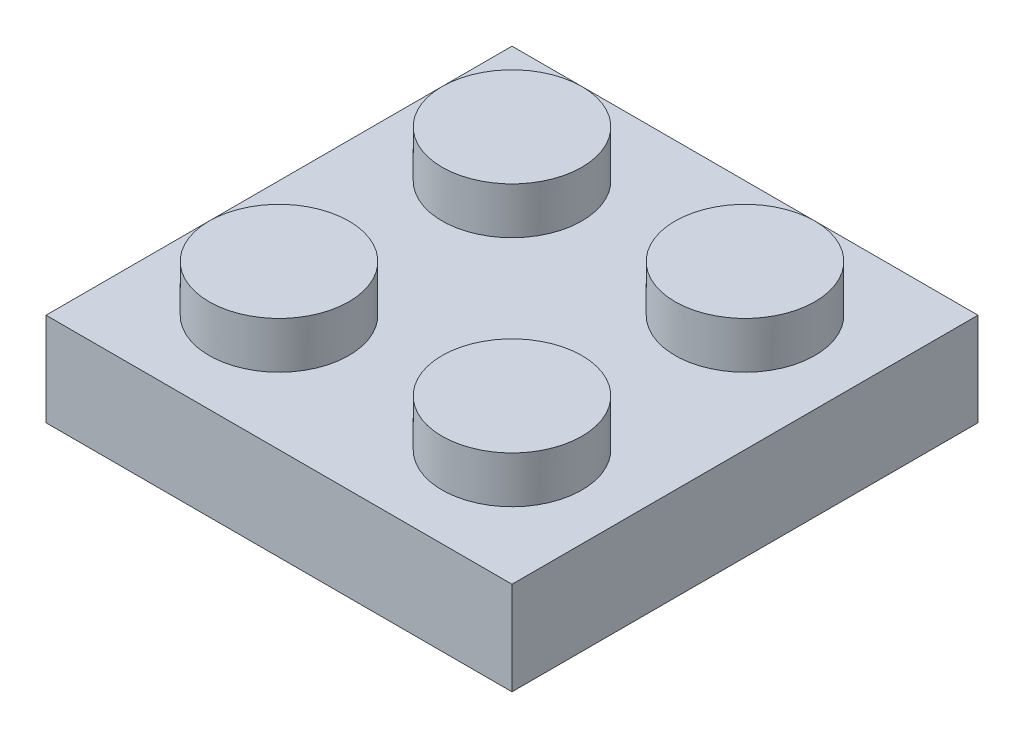
ISO-10303-21;
HEADER;
FILE_DESCRIPTION(('STEP AP214'),'2;1');
FILE_NAME('part.step','',(''),(''),'','','');
FILE_SCHEMA(('AUTOMOTIVE_DESIGN { 1 0 10303 214 1 1 1 1 }'));
ENDSEC;
DATA;
#1=APPLICATION_CONTEXT('core data for automotive mechanical design processes');
#2=APPLICATION_PROTOCOL_DEFINITION('international standard','automotive_design',2000,#1);
#3=PRODUCT_CONTEXT('',#1,'mechanical');
#4=PRODUCT('Part','Part','',(#3));
#5=PRODUCT_RELATED_PRODUCT_CATEGORY('part','',(#4));
#6=PRODUCT_DEFINITION_FORMATION('','',#4);
#7=PRODUCT_DEFINITION_CONTEXT('part definition',#1,'design');
#8=PRODUCT_DEFINITION('design','',#6,#7);
#9=PRODUCT_DEFINITION_SHAPE('','',#8);
#10=(LENGTH_UNIT() NAMED_UNIT(*) SI_UNIT(.MILLI.,.METRE.));
#11=(NAMED_UNIT(*) PLANE_ANGLE_UNIT() SI_UNIT($,.RADIAN.));
#12=(NAMED_UNIT(*) SI_UNIT($,.STERADIAN.) SOLID_ANGLE_UNIT());
#13=UNCERTAINTY_MEASURE_WITH_UNIT(LENGTH_MEASURE(1.E-05),#10,'distance_accuracy_value','');
#14=(GEOMETRIC_REPRESENTATION_CONTEXT(3) GLOBAL_UNCERTAINTY_ASSIGNED_CONTEXT((#13)) GLOBAL_UNIT_ASSIGNED_CONTEXT((#10,
#11,#12)) REPRESENTATION_CONTEXT('',''));
#15=CARTESIAN_POINT('',(0.,0.,0.));
#16=DIRECTION('',(0.,0.,1.));
#17=DIRECTION('',(1.,0.,0.));
#18=AXIS2_PLACEMENT_3D('',#15,#16,#17);
#19=CARTESIAN_POINT('',(0.,0.,0.));
#20=DIRECTION('',(0.,-1.,0.));
#21=DIRECTION('',(0.,0.,-1.));
#22=AXIS2_PLACEMENT_3D('',#19,#20,#21);
#23=PLANE('',#22);
#24=DIRECTION('',(0.,0.,1.));
#25=VECTOR('',#24,1.);
#26=CARTESIAN_POINT('',(0.,0.,0.));
#27=LINE('',#26,#25);
#28=CARTESIAN_POINT('',(0.,0.,-16.));
#29=VERTEX_POINT('',#28);
#30=CARTESIAN_POINT('',(0.,0.,0.));
#31=VERTEX_POINT('',#30);
#32=EDGE_CURVE('E192',#29,#31,#27,.T.);
#33=ORIENTED_EDGE('',*,*,#32,.F.);
#34=DIRECTION('',(-1.,0.,0.));
#35=VECTOR('',#34,1.);
#36=CARTESIAN_POINT('',(0.,0.,-16.));
#37=LINE('',#36,#35);
#38=CARTESIAN_POINT('',(16.,0.,-16.));
#39=VERTEX_POINT('',#38);
#40=EDGE_CURVE('E85',#39,#29,#37,.T.);
#41=ORIENTED_EDGE('',*,*,#40,.F.);
#42=DIRECTION('',(0.,0.,-1.));
#43=VECTOR('',#42,1.);
#44=CARTESIAN_POINT('',(16.,0.,0.));
#45=LINE('',#44,#43);
#46=CARTESIAN_POINT('',(16.,0.,0.));
#47=VERTEX_POINT('',#46);
#48=EDGE_CURVE('E210',#47,#39,#45,.T.);
#49=ORIENTED_EDGE('',*,*,#48,.F.);
#50=DIRECTION('',(1.,0.,0.));
#51=VECTOR('',#50,1.);
#52=CARTESIAN_POINT('',(0.,0.,0.));
#53=LINE('',#52,#51);
#54=EDGE_CURVE('E207',#31,#47,#53,.T.);
#55=ORIENTED_EDGE('',*,*,#54,.F.);
#56=EDGE_LOOP('',(#33,#41,#49,#55));
#57=FACE_BOUND('',#56,.T.);
#58=DIRECTION('',(-1.,0.,0.));
#59=VECTOR('',#58,1.);
#60=CARTESIAN_POINT('',(0.,0.,-14.4));
#61=LINE('',#60,#59);
#62=CARTESIAN_POINT('',(14.4,0.,-14.4));
#63=VERTEX_POINT('',#62);
#64=CARTESIAN_POINT('',(1.6,0.,-14.4));
#65=VERTEX_POINT('',#64);
#66=EDGE_CURVE('E175',#63,#65,#61,.T.);
#67=ORIENTED_EDGE('',*,*,#66,.T.);
#68=DIRECTION('',(0.,0.,1.));
#69=VECTOR('',#68,1.);
#70=CARTESIAN_POINT('',(1.6,0.,0.));
#71=LINE('',#70,#69);
#72=CARTESIAN_POINT('',(1.6,0.,-1.6));
#73=VERTEX_POINT('',#72);
#74=EDGE_CURVE('E166',#65,#73,#71,.T.);
#75=ORIENTED_EDGE('',*,*,#74,.T.);
#76=DIRECTION('',(1.,0.,0.));
#77=VECTOR('',#76,1.);
#78=CARTESIAN_POINT('',(0.,0.,-1.6));
#79=LINE('',#78,#77);
#80=CARTESIAN_POINT('',(14.4,0.,-1.6));
#81=VERTEX_POINT('',#80);
#82=EDGE_CURVE('E174',#73,#81,#79,.T.);
#83=ORIENTED_EDGE('',*,*,#82,.T.);
#84=DIRECTION('',(0.,0.,-1.));
#85=VECTOR('',#84,1.);
#86=CARTESIAN_POINT('',(14.4,0.,0.));
#87=LINE('',#86,#85);
#88=EDGE_CURVE('E55',#81,#63,#87,.T.);
#89=ORIENTED_EDGE('',*,*,#88,.T.);
#90=EDGE_LOOP('',(#67,#75,#83,#89));
#91=FACE_BOUND('',#90,.T.);
#92=ADVANCED_FACE('F39',(#57,#91),#23,.T.);
#93=CARTESIAN_POINT('',(4.,4.8,-12.));
#94=DIRECTION('',(0.,1.,0.));
#95=DIRECTION('',(0.,0.,1.));
#96=AXIS2_PLACEMENT_3D('',#93,#94,#95);
#97=PLANE('',#96);
#98=CARTESIAN_POINT('',(4.,4.8,-12.));
#99=DIRECTION('',(0.,1.,0.));
#100=DIRECTION('',(0.,0.,1.));
#101=AXIS2_PLACEMENT_3D('',#98,#99,#100);
#102=CIRCLE('',#101,2.4);
#103=CARTESIAN_POINT('',(4.,4.8,-9.6));
#104=VERTEX_POINT('',#103);
#105=EDGE_CURVE('E11',#104,#104,#102,.T.);
#106=ORIENTED_EDGE('',*,*,#105,.T.);
#107=EDGE_LOOP('',(#106));
#108=FACE_BOUND('',#107,.T.);
#109=ADVANCED_FACE('F41',(#108),#97,.T.);
#110=CARTESIAN_POINT('',(4.,4.8,-12.));
#111=DIRECTION('',(0.,-1.,0.));
#112=DIRECTION('',(0.,0.,-1.));
#113=AXIS2_PLACEMENT_3D('',#110,#111,#112);
#114=CYLINDRICAL_SURFACE('',#113,2.4);
#115=ORIENTED_EDGE('',*,*,#105,.F.);
#116=EDGE_LOOP('',(#115));
#117=FACE_BOUND('',#116,.T.);
#118=CARTESIAN_POINT('',(4.,3.2,-12.));
#119=DIRECTION('',(0.,-1.,0.));
#120=DIRECTION('',(0.,0.,-1.));
#121=AXIS2_PLACEMENT_3D('',#118,#119,#120);
#122=CIRCLE('',#121,2.4);
#123=CARTESIAN_POINT('',(4.,3.2,-14.4));
#124=VERTEX_POINT('',#123);
#125=EDGE_CURVE('E48',#124,#124,#122,.F.);
#126=ORIENTED_EDGE('',*,*,#125,.T.);
#127=EDGE_LOOP('',(#126));
#128=FACE_BOUND('',#127,.T.);
#129=ADVANCED_FACE('F246',(#117,#128),#114,.T.);
#130=CARTESIAN_POINT('',(12.,4.8,-12.));
#131=DIRECTION('',(0.,1.,0.));
#132=DIRECTION('',(0.,0.,1.));
#133=AXIS2_PLACEMENT_3D('',#130,#131,#132);
#134=PLANE('',#133);
#135=CARTESIAN_POINT('',(12.,4.8,-12.));
#136=DIRECTION('',(0.,1.,0.));
#137=DIRECTION('',(0.,0.,1.));
#138=AXIS2_PLACEMENT_3D('',#135,#136,#137);
#139=CIRCLE('',#138,2.4);
#140=CARTESIAN_POINT('',(12.,4.8,-9.6));
#141=VERTEX_POINT('',#140);
#142=EDGE_CURVE('E239',#141,#141,#139,.T.);
#143=ORIENTED_EDGE('',*,*,#142,.T.);
#144=EDGE_LOOP('',(#143));
#145=FACE_BOUND('',#144,.T.);
#146=ADVANCED_FACE('F288',(#145),#134,.T.);
#147=CARTESIAN_POINT('',(12.,4.8,-12.));
#148=DIRECTION('',(0.,-1.,0.));
#149=DIRECTION('',(0.,0.,-1.));
#150=AXIS2_PLACEMENT_3D('',#147,#148,#149);
#151=CYLINDRICAL_SURFACE('',#150,2.4);
#152=ORIENTED_EDGE('',*,*,#142,.F.);
#153=EDGE_LOOP('',(#152));
#154=FACE_BOUND('',#153,.T.);
#155=CARTESIAN_POINT('',(12.,3.2,-12.));
#156=DIRECTION('',(0.,-1.,0.));
#157=DIRECTION('',(0.,0.,-1.));
#158=AXIS2_PLACEMENT_3D('',#155,#156,#157);
#159=CIRCLE('',#158,2.4);
#160=CARTESIAN_POINT('',(12.,3.2,-14.4));
#161=VERTEX_POINT('',#160);
#162=EDGE_CURVE('E235',#161,#161,#159,.F.);
#163=ORIENTED_EDGE('',*,*,#162,.T.);
#164=EDGE_LOOP('',(#163));
#165=FACE_BOUND('',#164,.T.);
#166=ADVANCED_FACE('F284',(#154,#165),#151,.T.);
#167=CARTESIAN_POINT('',(0.,3.2,0.));
#168=DIRECTION('',(1.,0.,0.));
#169=DIRECTION('',(0.,0.,-1.));
#170=AXIS2_PLACEMENT_3D('',#167,#168,#169);
#171=PLANE('',#170);
#172=ORIENTED_EDGE('',*,*,#32,.T.);
#173=DIRECTION('',(0.,-1.,0.));
#174=VECTOR('',#173,1.);
#175=CARTESIAN_POINT('',(0.,3.2,0.));
#176=LINE('',#175,#174);
#177=CARTESIAN_POINT('',(0.,3.2,0.));
#178=VERTEX_POINT('',#177);
#179=EDGE_CURVE('E224',#178,#31,#176,.T.);
#180=ORIENTED_EDGE('',*,*,#179,.F.);
#181=DIRECTION('',(0.,0.,1.));
#182=VECTOR('',#181,1.);
#183=CARTESIAN_POINT('',(0.,3.2,0.));
#184=LINE('',#183,#182);
#185=CARTESIAN_POINT('',(0.,3.2,-16.));
#186=VERTEX_POINT('',#185);
#187=EDGE_CURVE('E193',#186,#178,#184,.T.);
#188=ORIENTED_EDGE('',*,*,#187,.F.);
#189=DIRECTION('',(0.,-1.,0.));
#190=VECTOR('',#189,1.);
#191=CARTESIAN_POINT('',(0.,3.2,-16.));
#192=LINE('',#191,#190);
#193=EDGE_CURVE('E203',#186,#29,#192,.T.);
#194=ORIENTED_EDGE('',*,*,#193,.T.);
#195=EDGE_LOOP('',(#172,#180,#188,#194));
#196=FACE_BOUND('',#195,.T.);
#197=ADVANCED_FACE('F281',(#196),#171,.F.);
#198=CARTESIAN_POINT('',(0.,3.2,0.));
#199=DIRECTION('',(0.,0.,-1.));
#200=DIRECTION('',(-1.,0.,0.));
#201=AXIS2_PLACEMENT_3D('',#198,#199,#200);
#202=PLANE('',#201);
#203=ORIENTED_EDGE('',*,*,#54,.T.);
#204=DIRECTION('',(0.,-1.,0.));
#205=VECTOR('',#204,1.);
#206=CARTESIAN_POINT('',(16.,3.2,0.));
#207=LINE('',#206,#205);
#208=CARTESIAN_POINT('',(16.,3.2,0.));
#209=VERTEX_POINT('',#208);
#210=EDGE_CURVE('E220',#209,#47,#207,.T.);
#211=ORIENTED_EDGE('',*,*,#210,.F.);
#212=DIRECTION('',(1.,0.,0.));
#213=VECTOR('',#212,1.);
#214=CARTESIAN_POINT('',(0.,3.2,0.));
#215=LINE('',#214,#213);
#216=EDGE_CURVE('E93',#178,#209,#215,.T.);
#217=ORIENTED_EDGE('',*,*,#216,.F.);
#218=ORIENTED_EDGE('',*,*,#179,.T.);
#219=EDGE_LOOP('',(#203,#211,#217,#218));
#220=FACE_BOUND('',#219,.T.);
#221=ADVANCED_FACE('F277',(#220),#202,.F.);
#222=CARTESIAN_POINT('',(16.,3.2,0.));
#223=DIRECTION('',(-1.,0.,0.));
#224=DIRECTION('',(0.,0.,1.));
#225=AXIS2_PLACEMENT_3D('',#222,#223,#224);
#226=PLANE('',#225);
#227=ORIENTED_EDGE('',*,*,#48,.T.);
#228=DIRECTION('',(0.,-1.,0.));
#229=VECTOR('',#228,1.);
#230=CARTESIAN_POINT('',(16.,3.2,-16.));
#231=LINE('',#230,#229);
#232=CARTESIAN_POINT('',(16.,3.2,-16.));
#233=VERTEX_POINT('',#232);
#234=EDGE_CURVE('E217',#233,#39,#231,.T.);
#235=ORIENTED_EDGE('',*,*,#234,.F.);
#236=DIRECTION('',(0.,0.,-1.));
#237=VECTOR('',#236,1.);
#238=CARTESIAN_POINT('',(16.,3.2,0.));
#239=LINE('',#238,#237);
#240=EDGE_CURVE('E198',#209,#233,#239,.T.);
#241=ORIENTED_EDGE('',*,*,#240,.F.);
#242=ORIENTED_EDGE('',*,*,#210,.T.);
#243=EDGE_LOOP('',(#227,#235,#241,#242));
#244=FACE_BOUND('',#243,.T.);
#245=ADVANCED_FACE('F261',(#244),#226,.F.);
#246=CARTESIAN_POINT('',(0.,3.2,-16.));
#247=DIRECTION('',(0.,0.,1.));
#248=DIRECTION('',(1.,0.,0.));
#249=AXIS2_PLACEMENT_3D('',#246,#247,#248);
#250=PLANE('',#249);
#251=ORIENTED_EDGE('',*,*,#40,.T.);
#252=ORIENTED_EDGE('',*,*,#193,.F.);
#253=DIRECTION('',(-1.,0.,0.));
#254=VECTOR('',#253,1.);
#255=CARTESIAN_POINT('',(0.,3.2,-16.));
#256=LINE('',#255,#254);
#257=EDGE_CURVE('E64',#233,#186,#256,.T.);
#258=ORIENTED_EDGE('',*,*,#257,.F.);
#259=ORIENTED_EDGE('',*,*,#234,.T.);
#260=EDGE_LOOP('',(#251,#252,#258,#259));
#261=FACE_BOUND('',#260,.T.);
#262=ADVANCED_FACE('F251',(#261),#250,.F.);
#263=CARTESIAN_POINT('',(0.,3.2,0.));
#264=DIRECTION('',(0.,-1.,0.));
#265=DIRECTION('',(0.,0.,-1.));
#266=AXIS2_PLACEMENT_3D('',#263,#264,#265);
#267=PLANE('',#266);
#268=CARTESIAN_POINT('',(4.,3.2,-4.));
#269=DIRECTION('',(0.,-1.,0.));
#270=DIRECTION('',(0.,0.,-1.));
#271=AXIS2_PLACEMENT_3D('',#268,#269,#270);
#272=CIRCLE('',#271,2.4);
#273=CARTESIAN_POINT('',(4.,3.2,-6.4));
#274=VERTEX_POINT('',#273);
#275=EDGE_CURVE('E231',#274,#274,#272,.F.);
#276=ORIENTED_EDGE('',*,*,#275,.F.);
#277=EDGE_LOOP('',(#276));
#278=FACE_BOUND('',#277,.T.);
#279=CARTESIAN_POINT('',(12.,3.2,-4.));
#280=DIRECTION('',(0.,-1.,0.));
#281=DIRECTION('',(0.,0.,-1.));
#282=AXIS2_PLACEMENT_3D('',#279,#280,#281);
#283=CIRCLE('',#282,2.4);
#284=CARTESIAN_POINT('',(12.,3.2,-6.4));
#285=VERTEX_POINT('',#284);
#286=EDGE_CURVE('E227',#285,#285,#283,.F.);
#287=ORIENTED_EDGE('',*,*,#286,.F.);
#288=EDGE_LOOP('',(#287));
#289=FACE_BOUND('',#288,.T.);
#290=ORIENTED_EDGE('',*,*,#187,.T.);
#291=ORIENTED_EDGE('',*,*,#216,.T.);
#292=ORIENTED_EDGE('',*,*,#240,.T.);
#293=ORIENTED_EDGE('',*,*,#257,.T.);
#294=EDGE_LOOP('',(#290,#291,#292,#293));
#295=FACE_BOUND('',#294,.T.);
#296=ORIENTED_EDGE('',*,*,#162,.F.);
#297=EDGE_LOOP('',(#296));
#298=FACE_BOUND('',#297,.T.);
#299=ORIENTED_EDGE('',*,*,#125,.F.);
#300=EDGE_LOOP('',(#299));
#301=FACE_BOUND('',#300,.T.);
#302=ADVANCED_FACE('F248',(#278,#289,#295,#298,#301),#267,.F.);
#303=CARTESIAN_POINT('',(12.,4.8,-4.));
#304=DIRECTION('',(0.,-1.,0.));
#305=DIRECTION('',(0.,0.,-1.));
#306=AXIS2_PLACEMENT_3D('',#303,#304,#305);
#307=CYLINDRICAL_SURFACE('',#306,2.4);
#308=CARTESIAN_POINT('',(12.,4.8,-4.));
#309=DIRECTION('',(0.,1.,0.));
#310=DIRECTION('',(0.,0.,1.));
#311=AXIS2_PLACEMENT_3D('',#308,#309,#310);
#312=CIRCLE('',#311,2.4);
#313=CARTESIAN_POINT('',(12.,4.8,-1.6));
#314=VERTEX_POINT('',#313);
#315=EDGE_CURVE('E187',#314,#314,#312,.T.);
#316=ORIENTED_EDGE('',*,*,#315,.F.);
#317=EDGE_LOOP('',(#316));
#318=FACE_BOUND('',#317,.T.);
#319=ORIENTED_EDGE('',*,*,#286,.T.);
#320=EDGE_LOOP('',(#319));
#321=FACE_BOUND('',#320,.T.);
#322=ADVANCED_FACE('F250',(#318,#321),#307,.T.);
#323=CARTESIAN_POINT('',(12.,4.8,-4.));
#324=DIRECTION('',(0.,1.,0.));
#325=DIRECTION('',(0.,0.,1.));
#326=AXIS2_PLACEMENT_3D('',#323,#324,#325);
#327=PLANE('',#326);
#328=ORIENTED_EDGE('',*,*,#315,.T.);
#329=EDGE_LOOP('',(#328));
#330=FACE_BOUND('',#329,.T.);
#331=ADVANCED_FACE('F258',(#330),#327,.T.);
#332=CARTESIAN_POINT('',(4.,4.8,-4.));
#333=DIRECTION('',(0.,-1.,0.));
#334=DIRECTION('',(0.,0.,-1.));
#335=AXIS2_PLACEMENT_3D('',#332,#333,#334);
#336=CYLINDRICAL_SURFACE('',#335,2.4);
#337=CARTESIAN_POINT('',(4.,4.8,-4.));
#338=DIRECTION('',(0.,1.,0.));
#339=DIRECTION('',(0.,0.,1.));
#340=AXIS2_PLACEMENT_3D('',#337,#338,#339);
#341=CIRCLE('',#340,2.4);
#342=CARTESIAN_POINT('',(4.,4.8,-1.6));
#343=VERTEX_POINT('',#342);
#344=EDGE_CURVE('E183',#343,#343,#341,.T.);
#345=ORIENTED_EDGE('',*,*,#344,.F.);
#346=EDGE_LOOP('',(#345));
#347=FACE_BOUND('',#346,.T.);
#348=ORIENTED_EDGE('',*,*,#275,.T.);
#349=EDGE_LOOP('',(#348));
#350=FACE_BOUND('',#349,.T.);
#351=ADVANCED_FACE('F338',(#347,#350),#336,.T.);
#352=CARTESIAN_POINT('',(4.,4.8,-4.));
#353=DIRECTION('',(0.,1.,0.));
#354=DIRECTION('',(0.,0.,1.));
#355=AXIS2_PLACEMENT_3D('',#352,#353,#354);
#356=PLANE('',#355);
#357=ORIENTED_EDGE('',*,*,#344,.T.);
#358=EDGE_LOOP('',(#357));
#359=FACE_BOUND('',#358,.T.);
#360=ADVANCED_FACE('F360',(#359),#356,.T.);
#361=CARTESIAN_POINT('',(4.,3.2,-12.));
#362=DIRECTION('',(0.,1.,0.));
#363=DIRECTION('',(0.,0.,1.));
#364=AXIS2_PLACEMENT_3D('',#361,#362,#363);
#365=PLANE('',#364);
#366=CARTESIAN_POINT('',(4.,3.2,-12.));
#367=DIRECTION('',(0.,1.,0.));
#368=DIRECTION('',(0.,0.,1.));
#369=AXIS2_PLACEMENT_3D('',#366,#367,#368);
#370=CIRCLE('',#369,0.799999999999999);
#371=CARTESIAN_POINT('',(4.,3.2,-11.2));
#372=VERTEX_POINT('',#371);
#373=EDGE_CURVE('E188',#372,#372,#370,.T.);
#374=ORIENTED_EDGE('',*,*,#373,.F.);
#375=EDGE_LOOP('',(#374));
#376=FACE_BOUND('',#375,.T.);
#377=ADVANCED_FACE('F369',(#376),#365,.F.);
#378=CARTESIAN_POINT('',(4.,4.8,-12.));
#379=DIRECTION('',(0.,-1.,0.));
#380=DIRECTION('',(0.,0.,-1.));
#381=AXIS2_PLACEMENT_3D('',#378,#379,#380);
#382=CYLINDRICAL_SURFACE('',#381,0.799999999999999);
#383=ORIENTED_EDGE('',*,*,#373,.T.);
#384=EDGE_LOOP('',(#383));
#385=FACE_BOUND('',#384,.T.);
#386=CARTESIAN_POINT('',(4.,1.6,-12.));
#387=DIRECTION('',(0.,-1.,0.));
#388=DIRECTION('',(0.,0.,-1.));
#389=AXIS2_PLACEMENT_3D('',#386,#387,#388);
#390=CIRCLE('',#389,0.799999999999999);
#391=CARTESIAN_POINT('',(4.,1.6,-12.8));
#392=VERTEX_POINT('',#391);
#393=EDGE_CURVE('E154',#392,#392,#390,.F.);
#394=ORIENTED_EDGE('',*,*,#393,.F.);
#395=EDGE_LOOP('',(#394));
#396=FACE_BOUND('',#395,.T.);
#397=ADVANCED_FACE('F382',(#385,#396),#382,.F.);
#398=CARTESIAN_POINT('',(12.,3.2,-12.));
#399=DIRECTION('',(0.,1.,0.));
#400=DIRECTION('',(0.,0.,1.));
#401=AXIS2_PLACEMENT_3D('',#398,#399,#400);
#402=PLANE('',#401);
#403=CARTESIAN_POINT('',(12.,3.2,-12.));
#404=DIRECTION('',(0.,1.,0.));
#405=DIRECTION('',(0.,0.,1.));
#406=AXIS2_PLACEMENT_3D('',#403,#404,#405);
#407=CIRCLE('',#406,0.799999999999999);
#408=CARTESIAN_POINT('',(12.,3.2,-11.2));
#409=VERTEX_POINT('',#408);
#410=EDGE_CURVE('E149',#409,#409,#407,.T.);
#411=ORIENTED_EDGE('',*,*,#410,.F.);
#412=EDGE_LOOP('',(#411));
#413=FACE_BOUND('',#412,.T.);
#414=ADVANCED_FACE('F391',(#413),#402,.F.);
#415=CARTESIAN_POINT('',(12.,4.8,-12.));
#416=DIRECTION('',(0.,-1.,0.));
#417=DIRECTION('',(0.,0.,-1.));
#418=AXIS2_PLACEMENT_3D('',#415,#416,#417);
#419=CYLINDRICAL_SURFACE('',#418,0.799999999999999);
#420=ORIENTED_EDGE('',*,*,#410,.T.);
#421=EDGE_LOOP('',(#420));
#422=FACE_BOUND('',#421,.T.);
#423=CARTESIAN_POINT('',(12.,1.6,-12.));
#424=DIRECTION('',(0.,-1.,0.));
#425=DIRECTION('',(0.,0.,-1.));
#426=AXIS2_PLACEMENT_3D('',#423,#424,#425);
#427=CIRCLE('',#426,0.799999999999999);
#428=CARTESIAN_POINT('',(12.,1.6,-12.8));
#429=VERTEX_POINT('',#428);
#430=EDGE_CURVE('E145',#429,#429,#427,.F.);
#431=ORIENTED_EDGE('',*,*,#430,.F.);
#432=EDGE_LOOP('',(#431));
#433=FACE_BOUND('',#432,.T.);
#434=ADVANCED_FACE('F400',(#422,#433),#419,.F.);
#435=CARTESIAN_POINT('',(1.6,3.2,0.));
#436=DIRECTION('',(1.,0.,0.));
#437=DIRECTION('',(0.,0.,-1.));
#438=AXIS2_PLACEMENT_3D('',#435,#436,#437);
#439=PLANE('',#438);
#440=ORIENTED_EDGE('',*,*,#74,.F.);
#441=DIRECTION('',(0.,-1.,0.));
#442=VECTOR('',#441,1.);
#443=CARTESIAN_POINT('',(1.6,3.2,-14.4));
#444=LINE('',#443,#442);
#445=CARTESIAN_POINT('',(1.6,1.6,-14.4));
#446=VERTEX_POINT('',#445);
#447=EDGE_CURVE('E141',#446,#65,#444,.T.);
#448=ORIENTED_EDGE('',*,*,#447,.F.);
#449=DIRECTION('',(0.,0.,1.));
#450=VECTOR('',#449,1.);
#451=CARTESIAN_POINT('',(1.6,1.6,0.));
#452=LINE('',#451,#450);
#453=CARTESIAN_POINT('',(1.6,1.6,-1.6));
#454=VERTEX_POINT('',#453);
#455=EDGE_CURVE('E127',#446,#454,#452,.T.);
#456=ORIENTED_EDGE('',*,*,#455,.T.);
#457=DIRECTION('',(0.,-1.,0.));
#458=VECTOR('',#457,1.);
#459=CARTESIAN_POINT('',(1.6,3.2,-1.6));
#460=LINE('',#459,#458);
#461=EDGE_CURVE('E120',#454,#73,#460,.T.);
#462=ORIENTED_EDGE('',*,*,#461,.T.);
#463=EDGE_LOOP('',(#440,#448,#456,#462));
#464=FACE_BOUND('',#463,.T.);
#465=ADVANCED_FACE('F409',(#464),#439,.T.);
#466=CARTESIAN_POINT('',(0.,3.2,-1.6));
#467=DIRECTION('',(0.,0.,-1.));
#468=DIRECTION('',(-1.,0.,0.));
#469=AXIS2_PLACEMENT_3D('',#466,#467,#468);
#470=PLANE('',#469);
#471=ORIENTED_EDGE('',*,*,#82,.F.);
#472=ORIENTED_EDGE('',*,*,#461,.F.);
#473=DIRECTION('',(1.,0.,0.));
#474=VECTOR('',#473,1.);
#475=CARTESIAN_POINT('',(0.,1.6,-1.6));
#476=LINE('',#475,#474);
#477=CARTESIAN_POINT('',(14.4,1.6,-1.6));
#478=VERTEX_POINT('',#477);
#479=EDGE_CURVE('E115',#454,#478,#476,.T.);
#480=ORIENTED_EDGE('',*,*,#479,.T.);
#481=DIRECTION('',(0.,-1.,0.));
#482=VECTOR('',#481,1.);
#483=CARTESIAN_POINT('',(14.4,3.2,-1.6));
#484=LINE('',#483,#482);
#485=EDGE_CURVE('E117',#478,#81,#484,.T.);
#486=ORIENTED_EDGE('',*,*,#485,.T.);
#487=EDGE_LOOP('',(#471,#472,#480,#486));
#488=FACE_BOUND('',#487,.T.);
#489=ADVANCED_FACE('F116',(#488),#470,.T.);
#490=CARTESIAN_POINT('',(14.4,3.2,0.));
#491=DIRECTION('',(-1.,0.,0.));
#492=DIRECTION('',(0.,0.,1.));
#493=AXIS2_PLACEMENT_3D('',#490,#491,#492);
#494=PLANE('',#493);
#495=ORIENTED_EDGE('',*,*,#88,.F.);
#496=ORIENTED_EDGE('',*,*,#485,.F.);
#497=DIRECTION('',(0.,0.,-1.));
#498=VECTOR('',#497,1.);
#499=CARTESIAN_POINT('',(14.4,1.6,0.));
#500=LINE('',#499,#498);
#501=CARTESIAN_POINT('',(14.4,1.6,-14.4));
#502=VERTEX_POINT('',#501);
#503=EDGE_CURVE('E126',#478,#502,#500,.T.);
#504=ORIENTED_EDGE('',*,*,#503,.T.);
#505=DIRECTION('',(0.,-1.,0.));
#506=VECTOR('',#505,1.);
#507=CARTESIAN_POINT('',(14.4,3.2,-14.4));
#508=LINE('',#507,#506);
#509=EDGE_CURVE('E132',#502,#63,#508,.T.);
#510=ORIENTED_EDGE('',*,*,#509,.T.);
#511=EDGE_LOOP('',(#495,#496,#504,#510));
#512=FACE_BOUND('',#511,.T.);
#513=ADVANCED_FACE('F129',(#512),#494,.T.);
#514=CARTESIAN_POINT('',(0.,3.2,-14.4));
#515=DIRECTION('',(0.,0.,1.));
#516=DIRECTION('',(1.,0.,0.));
#517=AXIS2_PLACEMENT_3D('',#514,#515,#516);
#518=PLANE('',#517);
#519=ORIENTED_EDGE('',*,*,#66,.F.);
#520=ORIENTED_EDGE('',*,*,#509,.F.);
#521=DIRECTION('',(-1.,0.,0.));
#522=VECTOR('',#521,1.);
#523=CARTESIAN_POINT('',(0.,1.6,-14.4));
#524=LINE('',#523,#522);
#525=EDGE_CURVE('E137',#502,#446,#524,.T.);
#526=ORIENTED_EDGE('',*,*,#525,.T.);
#527=ORIENTED_EDGE('',*,*,#447,.T.);
#528=EDGE_LOOP('',(#519,#520,#526,#527));
#529=FACE_BOUND('',#528,.T.);
#530=ADVANCED_FACE('F433',(#529),#518,.T.);
#531=CARTESIAN_POINT('',(0.,1.6,0.));
#532=DIRECTION('',(0.,-1.,0.));
#533=DIRECTION('',(0.,0.,-1.));
#534=AXIS2_PLACEMENT_3D('',#531,#532,#533);
#535=PLANE('',#534);
#536=CARTESIAN_POINT('',(4.,1.6,-4.));
#537=DIRECTION('',(0.,-1.,0.));
#538=DIRECTION('',(0.,0.,-1.));
#539=AXIS2_PLACEMENT_3D('',#536,#537,#538);
#540=CIRCLE('',#539,0.799999999999999);
#541=CARTESIAN_POINT('',(4.,1.6,-4.8));
#542=VERTEX_POINT('',#541);
#543=EDGE_CURVE('E150',#542,#542,#540,.F.);
#544=ORIENTED_EDGE('',*,*,#543,.T.);
#545=EDGE_LOOP('',(#544));
#546=FACE_BOUND('',#545,.T.);
#547=CARTESIAN_POINT('',(12.,1.6,-4.));
#548=DIRECTION('',(0.,-1.,0.));
#549=DIRECTION('',(0.,0.,-1.));
#550=AXIS2_PLACEMENT_3D('',#547,#548,#549);
#551=CIRCLE('',#550,0.799999999999999);
#552=CARTESIAN_POINT('',(12.,1.6,-4.8));
#553=VERTEX_POINT('',#552);
#554=EDGE_CURVE('E157',#553,#553,#551,.F.);
#555=ORIENTED_EDGE('',*,*,#554,.T.);
#556=EDGE_LOOP('',(#555));
#557=FACE_BOUND('',#556,.T.);
#558=ORIENTED_EDGE('',*,*,#455,.F.);
#559=ORIENTED_EDGE('',*,*,#525,.F.);
#560=ORIENTED_EDGE('',*,*,#503,.F.);
#561=ORIENTED_EDGE('',*,*,#479,.F.);
#562=EDGE_LOOP('',(#558,#559,#560,#561));
#563=FACE_BOUND('',#562,.T.);
#564=ORIENTED_EDGE('',*,*,#430,.T.);
#565=EDGE_LOOP('',(#564));
#566=FACE_BOUND('',#565,.T.);
#567=ORIENTED_EDGE('',*,*,#393,.T.);
#568=EDGE_LOOP('',(#567));
#569=FACE_BOUND('',#568,.T.);
#570=ADVANCED_FACE('F135',(#546,#557,#563,#566,#569),#535,.T.);
#571=CARTESIAN_POINT('',(12.,4.8,-4.));
#572=DIRECTION('',(0.,-1.,0.));
#573=DIRECTION('',(0.,0.,-1.));
#574=AXIS2_PLACEMENT_3D('',#571,#572,#573);
#575=CYLINDRICAL_SURFACE('',#574,0.799999999999999);
#576=CARTESIAN_POINT('',(12.,3.2,-4.));
#577=DIRECTION('',(0.,1.,0.));
#578=DIRECTION('',(0.,0.,1.));
#579=AXIS2_PLACEMENT_3D('',#576,#577,#578);
#580=CIRCLE('',#579,0.799999999999999);
#581=CARTESIAN_POINT('',(12.,3.2,-3.2));
#582=VERTEX_POINT('',#581);
#583=EDGE_CURVE('E162',#582,#582,#580,.T.);
#584=ORIENTED_EDGE('',*,*,#583,.T.);
#585=EDGE_LOOP('',(#584));
#586=FACE_BOUND('',#585,.T.);
#587=ORIENTED_EDGE('',*,*,#554,.F.);
#588=EDGE_LOOP('',(#587));
#589=FACE_BOUND('',#588,.T.);
#590=ADVANCED_FACE('F449',(#586,#589),#575,.F.);
#591=CARTESIAN_POINT('',(12.,3.2,-4.));
#592=DIRECTION('',(0.,1.,0.));
#593=DIRECTION('',(0.,0.,1.));
#594=AXIS2_PLACEMENT_3D('',#591,#592,#593);
#595=PLANE('',#594);
#596=ORIENTED_EDGE('',*,*,#583,.F.);
#597=EDGE_LOOP('',(#596));
#598=FACE_BOUND('',#597,.T.);
#599=ADVANCED_FACE('F458',(#598),#595,.F.);
#600=CARTESIAN_POINT('',(4.,4.8,-4.));
#601=DIRECTION('',(0.,-1.,0.));
#602=DIRECTION('',(0.,0.,-1.));
#603=AXIS2_PLACEMENT_3D('',#600,#601,#602);
#604=CYLINDRICAL_SURFACE('',#603,0.799999999999999);
#605=CARTESIAN_POINT('',(4.,3.2,-4.));
#606=DIRECTION('',(0.,1.,0.));
#607=DIRECTION('',(0.,0.,1.));
#608=AXIS2_PLACEMENT_3D('',#605,#606,#607);
#609=CIRCLE('',#608,0.799999999999999);
#610=CARTESIAN_POINT('',(4.,3.2,-3.2));
#611=VERTEX_POINT('',#610);
#612=EDGE_CURVE('E167',#611,#611,#609,.T.);
#613=ORIENTED_EDGE('',*,*,#612,.T.);
#614=EDGE_LOOP('',(#613));
#615=FACE_BOUND('',#614,.T.);
#616=ORIENTED_EDGE('',*,*,#543,.F.);
#617=EDGE_LOOP('',(#616));
#618=FACE_BOUND('',#617,.T.);
#619=ADVANCED_FACE('F467',(#615,#618),#604,.F.);
#620=CARTESIAN_POINT('',(4.,3.2,-4.));
#621=DIRECTION('',(0.,1.,0.));
#622=DIRECTION('',(0.,0.,1.));
#623=AXIS2_PLACEMENT_3D('',#620,#621,#622);
#624=PLANE('',#623);
#625=ORIENTED_EDGE('',*,*,#612,.F.);
#626=EDGE_LOOP('',(#625));
#627=FACE_BOUND('',#626,.T.);
#628=ADVANCED_FACE('F476',(#627),#624,.F.);
#629=CLOSED_SHELL('',(#92,#109,#129,#146,#166,#197,#221,#245,#262,#302,#322,#331,#351,#360,#377,
#397,#414,#434,#465,#489,#513,#530,#570,#590,#599,#619,#628));
#630=MANIFOLD_SOLID_BREP('B2',#629);
#631=ADVANCED_BREP_SHAPE_REPRESENTATION('',(#18,#630),#14);
#632=SHAPE_DEFINITION_REPRESENTATION(#9,#631);
ENDSEC;
END-ISO-10303-21;
